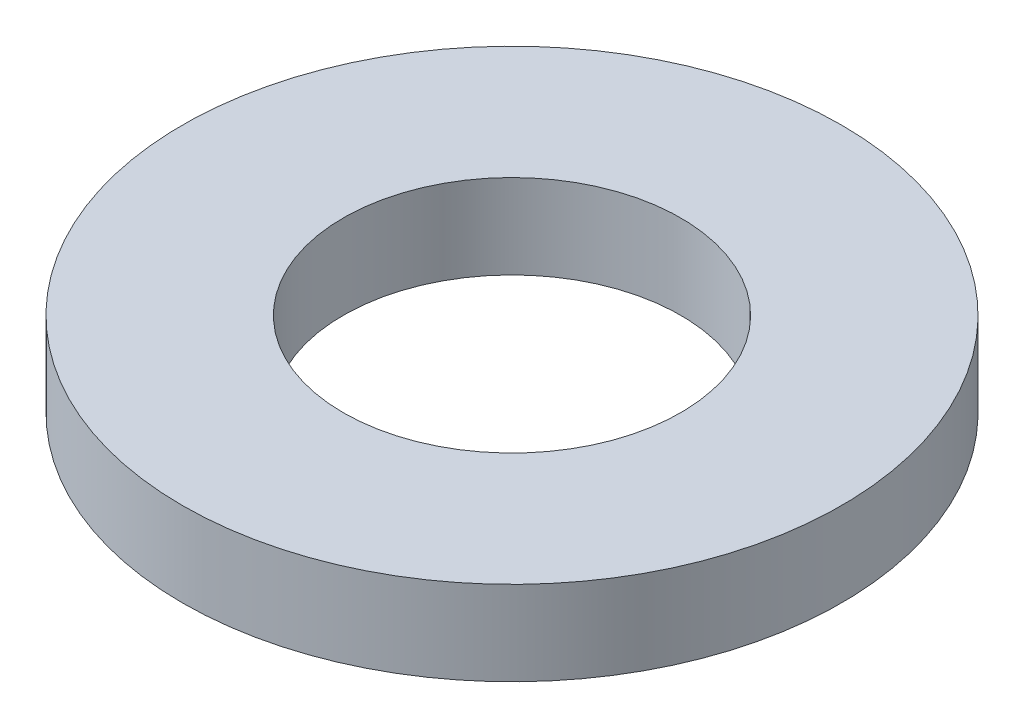
ISO-10303-21;
HEADER;
FILE_DESCRIPTION(('STEP AP214'),'2;1');
FILE_NAME('part.step','',(''),(''),'','','');
FILE_SCHEMA(('AUTOMOTIVE_DESIGN { 1 0 10303 214 1 1 1 1 }'));
ENDSEC;
DATA;
#1=APPLICATION_CONTEXT('core data for automotive mechanical design processes');
#2=APPLICATION_PROTOCOL_DEFINITION('international standard','automotive_design',2000,#1);
#3=PRODUCT_CONTEXT('',#1,'mechanical');
#4=PRODUCT('Part','Part','',(#3));
#5=PRODUCT_RELATED_PRODUCT_CATEGORY('part','',(#4));
#6=PRODUCT_DEFINITION_FORMATION('','',#4);
#7=PRODUCT_DEFINITION_CONTEXT('part definition',#1,'design');
#8=PRODUCT_DEFINITION('design','',#6,#7);
#9=PRODUCT_DEFINITION_SHAPE('','',#8);
#10=(LENGTH_UNIT() NAMED_UNIT(*) SI_UNIT(.MILLI.,.METRE.));
#11=(NAMED_UNIT(*) PLANE_ANGLE_UNIT() SI_UNIT($,.RADIAN.));
#12=(NAMED_UNIT(*) SI_UNIT($,.STERADIAN.) SOLID_ANGLE_UNIT());
#13=UNCERTAINTY_MEASURE_WITH_UNIT(LENGTH_MEASURE(1.E-05),#10,'distance_accuracy_value','');
#14=(GEOMETRIC_REPRESENTATION_CONTEXT(3) GLOBAL_UNCERTAINTY_ASSIGNED_CONTEXT((#13)) GLOBAL_UNIT_ASSIGNED_CONTEXT((#10,
#11,#12)) REPRESENTATION_CONTEXT('',''));
#15=CARTESIAN_POINT('',(0.,0.,0.));
#16=DIRECTION('',(0.,0.,1.));
#17=DIRECTION('',(1.,0.,0.));
#18=AXIS2_PLACEMENT_3D('',#15,#16,#17);
#19=CARTESIAN_POINT('',(0.,1.6,0.));
#20=DIRECTION('',(0.,1.,0.));
#21=DIRECTION('',(0.,0.,1.));
#22=AXIS2_PLACEMENT_3D('',#19,#20,#21);
#23=PLANE('',#22);
#24=CARTESIAN_POINT('',(0.,1.6,0.));
#25=DIRECTION('',(0.,1.,0.));
#26=DIRECTION('',(0.,0.,1.));
#27=AXIS2_PLACEMENT_3D('',#24,#25,#26);
#28=CIRCLE('',#27,6.25);
#29=CARTESIAN_POINT('',(0.,1.6,6.25));
#30=VERTEX_POINT('',#29);
#31=EDGE_CURVE('E10',#30,#30,#28,.T.);
#32=ORIENTED_EDGE('',*,*,#31,.T.);
#33=EDGE_LOOP('',(#32));
#34=FACE_BOUND('',#33,.T.);
#35=CARTESIAN_POINT('',(0.,1.6,0.));
#36=DIRECTION('',(0.,1.,0.));
#37=DIRECTION('',(0.,0.,1.));
#38=AXIS2_PLACEMENT_3D('',#35,#36,#37);
#39=CIRCLE('',#38,3.2);
#40=CARTESIAN_POINT('',(0.,1.6,3.2));
#41=VERTEX_POINT('',#40);
#42=EDGE_CURVE('E38',#41,#41,#39,.T.);
#43=ORIENTED_EDGE('',*,*,#42,.F.);
#44=EDGE_LOOP('',(#43));
#45=FACE_BOUND('',#44,.T.);
#46=ADVANCED_FACE('F27',(#34,#45),#23,.T.);
#47=CARTESIAN_POINT('',(0.,0.,0.));
#48=DIRECTION('',(0.,1.,0.));
#49=DIRECTION('',(0.,0.,1.));
#50=AXIS2_PLACEMENT_3D('',#47,#48,#49);
#51=PLANE('',#50);
#52=CARTESIAN_POINT('',(0.,0.,0.));
#53=DIRECTION('',(0.,1.,0.));
#54=DIRECTION('',(0.,0.,1.));
#55=AXIS2_PLACEMENT_3D('',#52,#53,#54);
#56=CIRCLE('',#55,6.25);
#57=CARTESIAN_POINT('',(0.,0.,6.25));
#58=VERTEX_POINT('',#57);
#59=EDGE_CURVE('E34',#58,#58,#56,.T.);
#60=ORIENTED_EDGE('',*,*,#59,.F.);
#61=EDGE_LOOP('',(#60));
#62=FACE_BOUND('',#61,.T.);
#63=CARTESIAN_POINT('',(0.,0.,0.));
#64=DIRECTION('',(0.,1.,0.));
#65=DIRECTION('',(0.,0.,1.));
#66=AXIS2_PLACEMENT_3D('',#63,#64,#65);
#67=CIRCLE('',#66,3.2);
#68=CARTESIAN_POINT('',(0.,0.,3.2));
#69=VERTEX_POINT('',#68);
#70=EDGE_CURVE('E42',#69,#69,#67,.T.);
#71=ORIENTED_EDGE('',*,*,#70,.T.);
#72=EDGE_LOOP('',(#71));
#73=FACE_BOUND('',#72,.T.);
#74=ADVANCED_FACE('F48',(#62,#73),#51,.F.);
#75=CARTESIAN_POINT('',(0.,1.6,0.));
#76=DIRECTION('',(0.,-1.,0.));
#77=DIRECTION('',(0.,0.,-1.));
#78=AXIS2_PLACEMENT_3D('',#75,#76,#77);
#79=CYLINDRICAL_SURFACE('',#78,6.25);
#80=ORIENTED_EDGE('',*,*,#31,.F.);
#81=EDGE_LOOP('',(#80));
#82=FACE_BOUND('',#81,.T.);
#83=ORIENTED_EDGE('',*,*,#59,.T.);
#84=EDGE_LOOP('',(#83));
#85=FACE_BOUND('',#84,.T.);
#86=ADVANCED_FACE('F29',(#82,#85),#79,.T.);
#87=CARTESIAN_POINT('',(0.,1.6,0.));
#88=DIRECTION('',(0.,-1.,0.));
#89=DIRECTION('',(0.,0.,-1.));
#90=AXIS2_PLACEMENT_3D('',#87,#88,#89);
#91=CYLINDRICAL_SURFACE('',#90,3.2);
#92=ORIENTED_EDGE('',*,*,#42,.T.);
#93=EDGE_LOOP('',(#92));
#94=FACE_BOUND('',#93,.T.);
#95=ORIENTED_EDGE('',*,*,#70,.F.);
#96=EDGE_LOOP('',(#95));
#97=FACE_BOUND('',#96,.T.);
#98=ADVANCED_FACE('F50',(#94,#97),#91,.F.);
#99=CLOSED_SHELL('',(#46,#74,#86,#98));
#100=MANIFOLD_SOLID_BREP('B2',#99);
#101=ADVANCED_BREP_SHAPE_REPRESENTATION('',(#18,#100),#14);
#102=SHAPE_DEFINITION_REPRESENTATION(#9,#101);
ENDSEC;
END-ISO-10303-21;
